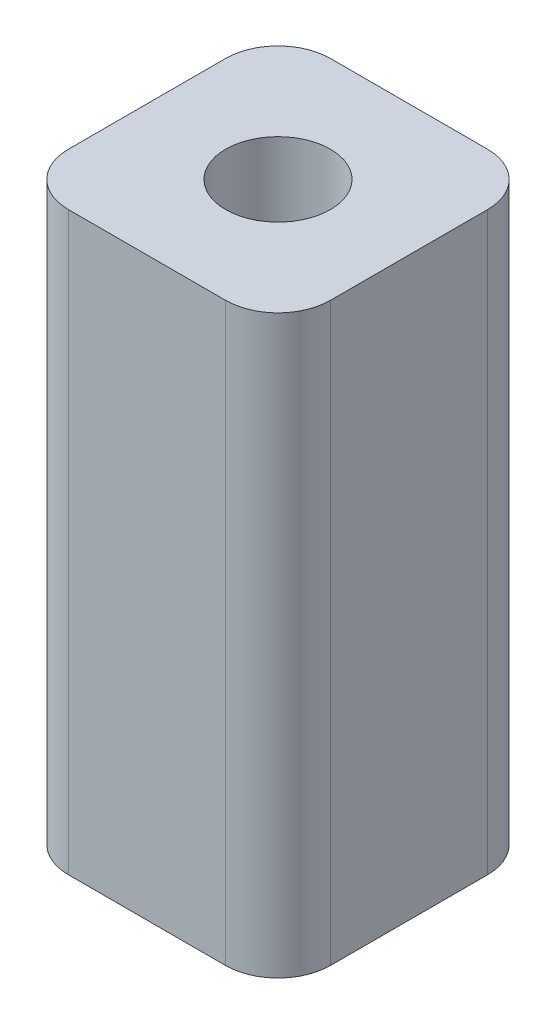
ISO-10303-21;
HEADER;
FILE_DESCRIPTION(('STEP AP214'),'2;1');
FILE_NAME('part.step','',(''),(''),'','','');
FILE_SCHEMA(('AUTOMOTIVE_DESIGN { 1 0 10303 214 1 1 1 1 }'));
ENDSEC;
DATA;
#1=APPLICATION_CONTEXT('core data for automotive mechanical design processes');
#2=APPLICATION_PROTOCOL_DEFINITION('international standard','automotive_design',2000,#1);
#3=PRODUCT_CONTEXT('',#1,'mechanical');
#4=PRODUCT('Part','Part','',(#3));
#5=PRODUCT_RELATED_PRODUCT_CATEGORY('part','',(#4));
#6=PRODUCT_DEFINITION_FORMATION('','',#4);
#7=PRODUCT_DEFINITION_CONTEXT('part definition',#1,'design');
#8=PRODUCT_DEFINITION('design','',#6,#7);
#9=PRODUCT_DEFINITION_SHAPE('','',#8);
#10=(LENGTH_UNIT() NAMED_UNIT(*) SI_UNIT(.MILLI.,.METRE.));
#11=(NAMED_UNIT(*) PLANE_ANGLE_UNIT() SI_UNIT($,.RADIAN.));
#12=(NAMED_UNIT(*) SI_UNIT($,.STERADIAN.) SOLID_ANGLE_UNIT());
#13=UNCERTAINTY_MEASURE_WITH_UNIT(LENGTH_MEASURE(1.E-05),#10,'distance_accuracy_value','');
#14=(GEOMETRIC_REPRESENTATION_CONTEXT(3) GLOBAL_UNCERTAINTY_ASSIGNED_CONTEXT((#13)) GLOBAL_UNIT_ASSIGNED_CONTEXT((#10,
#11,#12)) REPRESENTATION_CONTEXT('',''));
#15=CARTESIAN_POINT('',(0.,0.,0.));
#16=DIRECTION('',(0.,0.,1.));
#17=DIRECTION('',(1.,0.,0.));
#18=AXIS2_PLACEMENT_3D('',#15,#16,#17);
#19=CARTESIAN_POINT('',(-1.5,11.,1.5));
#20=DIRECTION('',(0.,1.,0.));
#21=DIRECTION('',(0.,0.,1.));
#22=AXIS2_PLACEMENT_3D('',#19,#20,#21);
#23=PLANE('',#22);
#24=CARTESIAN_POINT('',(-1.5,11.,1.5));
#25=DIRECTION('',(0.,1.,0.));
#26=DIRECTION('',(0.,0.,1.));
#27=AXIS2_PLACEMENT_3D('',#24,#25,#26);
#28=CIRCLE('',#27,1.);
#29=CARTESIAN_POINT('',(-2.5,11.,1.49999999999999));
#30=VERTEX_POINT('',#29);
#31=CARTESIAN_POINT('',(-1.49999999999999,11.,2.5));
#32=VERTEX_POINT('',#31);
#33=EDGE_CURVE('E164',#30,#32,#28,.T.);
#34=ORIENTED_EDGE('',*,*,#33,.T.);
#35=DIRECTION('',(1.,0.,0.));
#36=VECTOR('',#35,1.);
#37=CARTESIAN_POINT('',(-1.49999999999999,11.,2.5));
#38=LINE('',#37,#36);
#39=CARTESIAN_POINT('',(1.49999999999999,11.,2.5));
#40=VERTEX_POINT('',#39);
#41=EDGE_CURVE('E100',#32,#40,#38,.T.);
#42=ORIENTED_EDGE('',*,*,#41,.T.);
#43=CARTESIAN_POINT('',(1.5,11.,1.5));
#44=DIRECTION('',(0.,1.,0.));
#45=DIRECTION('',(0.,0.,1.));
#46=AXIS2_PLACEMENT_3D('',#43,#44,#45);
#47=CIRCLE('',#46,1.);
#48=CARTESIAN_POINT('',(2.5,11.,1.49999999999999));
#49=VERTEX_POINT('',#48);
#50=EDGE_CURVE('E185',#40,#49,#47,.T.);
#51=ORIENTED_EDGE('',*,*,#50,.T.);
#52=DIRECTION('',(0.,0.,-1.));
#53=VECTOR('',#52,1.);
#54=CARTESIAN_POINT('',(2.5,11.,-1.49999999999999));
#55=LINE('',#54,#53);
#56=CARTESIAN_POINT('',(2.5,11.,-1.49999999999999));
#57=VERTEX_POINT('',#56);
#58=EDGE_CURVE('E199',#49,#57,#55,.T.);
#59=ORIENTED_EDGE('',*,*,#58,.T.);
#60=CARTESIAN_POINT('',(1.5,11.,-1.5));
#61=DIRECTION('',(0.,1.,0.));
#62=DIRECTION('',(0.,0.,-1.));
#63=AXIS2_PLACEMENT_3D('',#60,#61,#62);
#64=CIRCLE('',#63,1.);
#65=CARTESIAN_POINT('',(1.49999999999999,11.,-2.5));
#66=VERTEX_POINT('',#65);
#67=EDGE_CURVE('E119',#57,#66,#64,.T.);
#68=ORIENTED_EDGE('',*,*,#67,.T.);
#69=DIRECTION('',(-1.,0.,0.));
#70=VECTOR('',#69,1.);
#71=CARTESIAN_POINT('',(-1.49999999999999,11.,-2.5));
#72=LINE('',#71,#70);
#73=CARTESIAN_POINT('',(-1.49999999999999,11.,-2.5));
#74=VERTEX_POINT('',#73);
#75=EDGE_CURVE('E113',#66,#74,#72,.T.);
#76=ORIENTED_EDGE('',*,*,#75,.T.);
#77=CARTESIAN_POINT('',(-1.5,11.,-1.5));
#78=DIRECTION('',(0.,1.,0.));
#79=DIRECTION('',(0.,0.,1.));
#80=AXIS2_PLACEMENT_3D('',#77,#78,#79);
#81=CIRCLE('',#80,1.);
#82=CARTESIAN_POINT('',(-2.5,11.,-1.49999999999999));
#83=VERTEX_POINT('',#82);
#84=EDGE_CURVE('E117',#74,#83,#81,.T.);
#85=ORIENTED_EDGE('',*,*,#84,.T.);
#86=DIRECTION('',(0.,0.,1.));
#87=VECTOR('',#86,1.);
#88=CARTESIAN_POINT('',(-2.5,11.,-1.49999999999999));
#89=LINE('',#88,#87);
#90=EDGE_CURVE('E57',#83,#30,#89,.T.);
#91=ORIENTED_EDGE('',*,*,#90,.T.);
#92=EDGE_LOOP('',(#34,#42,#51,#59,#68,#76,#85,#91));
#93=FACE_BOUND('',#92,.T.);
#94=CARTESIAN_POINT('',(0.,11.,0.));
#95=DIRECTION('',(0.,1.,0.));
#96=DIRECTION('',(0.,0.,1.));
#97=AXIS2_PLACEMENT_3D('',#94,#95,#96);
#98=CIRCLE('',#97,1.);
#99=CARTESIAN_POINT('',(0.,11.,1.));
#100=VERTEX_POINT('',#99);
#101=EDGE_CURVE('E146',#100,#100,#98,.T.);
#102=ORIENTED_EDGE('',*,*,#101,.F.);
#103=EDGE_LOOP('',(#102));
#104=FACE_BOUND('',#103,.T.);
#105=ADVANCED_FACE('F39',(#93,#104),#23,.T.);
#106=CARTESIAN_POINT('',(-1.5,0.,1.5));
#107=DIRECTION('',(0.,1.,0.));
#108=DIRECTION('',(0.,0.,1.));
#109=AXIS2_PLACEMENT_3D('',#106,#107,#108);
#110=PLANE('',#109);
#111=CARTESIAN_POINT('',(-1.5,0.,1.5));
#112=DIRECTION('',(0.,1.,0.));
#113=DIRECTION('',(0.,0.,1.));
#114=AXIS2_PLACEMENT_3D('',#111,#112,#113);
#115=CIRCLE('',#114,1.);
#116=CARTESIAN_POINT('',(-2.5,0.,1.49999999999999));
#117=VERTEX_POINT('',#116);
#118=CARTESIAN_POINT('',(-1.49999999999999,0.,2.5));
#119=VERTEX_POINT('',#118);
#120=EDGE_CURVE('E141',#117,#119,#115,.T.);
#121=ORIENTED_EDGE('',*,*,#120,.F.);
#122=DIRECTION('',(0.,0.,1.));
#123=VECTOR('',#122,1.);
#124=CARTESIAN_POINT('',(-2.5,0.,-1.49999999999999));
#125=LINE('',#124,#123);
#126=CARTESIAN_POINT('',(-2.5,0.,-1.49999999999999));
#127=VERTEX_POINT('',#126);
#128=EDGE_CURVE('E92',#127,#117,#125,.T.);
#129=ORIENTED_EDGE('',*,*,#128,.F.);
#130=CARTESIAN_POINT('',(-1.5,0.,-1.5));
#131=DIRECTION('',(0.,1.,0.));
#132=DIRECTION('',(0.,0.,1.));
#133=AXIS2_PLACEMENT_3D('',#130,#131,#132);
#134=CIRCLE('',#133,1.);
#135=CARTESIAN_POINT('',(-1.49999999999999,0.,-2.5));
#136=VERTEX_POINT('',#135);
#137=EDGE_CURVE('E86',#136,#127,#134,.T.);
#138=ORIENTED_EDGE('',*,*,#137,.F.);
#139=DIRECTION('',(-1.,0.,0.));
#140=VECTOR('',#139,1.);
#141=CARTESIAN_POINT('',(-1.49999999999999,0.,-2.5));
#142=LINE('',#141,#140);
#143=CARTESIAN_POINT('',(1.49999999999999,0.,-2.5));
#144=VERTEX_POINT('',#143);
#145=EDGE_CURVE('E128',#144,#136,#142,.T.);
#146=ORIENTED_EDGE('',*,*,#145,.F.);
#147=CARTESIAN_POINT('',(1.5,0.,-1.5));
#148=DIRECTION('',(0.,1.,0.));
#149=DIRECTION('',(0.,0.,-1.));
#150=AXIS2_PLACEMENT_3D('',#147,#148,#149);
#151=CIRCLE('',#150,1.);
#152=CARTESIAN_POINT('',(2.5,0.,-1.49999999999999));
#153=VERTEX_POINT('',#152);
#154=EDGE_CURVE('E155',#153,#144,#151,.T.);
#155=ORIENTED_EDGE('',*,*,#154,.F.);
#156=DIRECTION('',(0.,0.,-1.));
#157=VECTOR('',#156,1.);
#158=CARTESIAN_POINT('',(2.5,0.,-1.49999999999999));
#159=LINE('',#158,#157);
#160=CARTESIAN_POINT('',(2.5,0.,1.49999999999999));
#161=VERTEX_POINT('',#160);
#162=EDGE_CURVE('E152',#161,#153,#159,.T.);
#163=ORIENTED_EDGE('',*,*,#162,.F.);
#164=CARTESIAN_POINT('',(1.5,0.,1.5));
#165=DIRECTION('',(0.,1.,0.));
#166=DIRECTION('',(0.,0.,1.));
#167=AXIS2_PLACEMENT_3D('',#164,#165,#166);
#168=CIRCLE('',#167,1.);
#169=CARTESIAN_POINT('',(1.49999999999999,0.,2.5));
#170=VERTEX_POINT('',#169);
#171=EDGE_CURVE('E149',#170,#161,#168,.T.);
#172=ORIENTED_EDGE('',*,*,#171,.F.);
#173=DIRECTION('',(1.,0.,0.));
#174=VECTOR('',#173,1.);
#175=CARTESIAN_POINT('',(-1.49999999999999,0.,2.5));
#176=LINE('',#175,#174);
#177=EDGE_CURVE('E145',#119,#170,#176,.T.);
#178=ORIENTED_EDGE('',*,*,#177,.F.);
#179=EDGE_LOOP('',(#121,#129,#138,#146,#155,#163,#172,#178));
#180=FACE_BOUND('',#179,.T.);
#181=CARTESIAN_POINT('',(0.,0.,0.));
#182=DIRECTION('',(0.,1.,0.));
#183=DIRECTION('',(0.,0.,1.));
#184=AXIS2_PLACEMENT_3D('',#181,#182,#183);
#185=CIRCLE('',#184,1.);
#186=CARTESIAN_POINT('',(0.,0.,1.));
#187=VERTEX_POINT('',#186);
#188=EDGE_CURVE('E209',#187,#187,#185,.T.);
#189=ORIENTED_EDGE('',*,*,#188,.T.);
#190=EDGE_LOOP('',(#189));
#191=FACE_BOUND('',#190,.T.);
#192=ADVANCED_FACE('F189',(#180,#191),#110,.F.);
#193=CARTESIAN_POINT('',(-1.5,11.,1.5));
#194=DIRECTION('',(0.,-1.,0.));
#195=DIRECTION('',(0.,0.,-1.));
#196=AXIS2_PLACEMENT_3D('',#193,#194,#195);
#197=CYLINDRICAL_SURFACE('',#196,1.);
#198=ORIENTED_EDGE('',*,*,#120,.T.);
#199=DIRECTION('',(0.,-1.,0.));
#200=VECTOR('',#199,1.);
#201=CARTESIAN_POINT('',(-1.49999999999999,11.,2.5));
#202=LINE('',#201,#200);
#203=EDGE_CURVE('E11',#32,#119,#202,.T.);
#204=ORIENTED_EDGE('',*,*,#203,.F.);
#205=ORIENTED_EDGE('',*,*,#33,.F.);
#206=DIRECTION('',(0.,-1.,0.));
#207=VECTOR('',#206,1.);
#208=CARTESIAN_POINT('',(-2.5,11.,1.49999999999999));
#209=LINE('',#208,#207);
#210=EDGE_CURVE('E137',#30,#117,#209,.T.);
#211=ORIENTED_EDGE('',*,*,#210,.T.);
#212=EDGE_LOOP('',(#198,#204,#205,#211));
#213=FACE_BOUND('',#212,.T.);
#214=ADVANCED_FACE('F41',(#213),#197,.T.);
#215=CARTESIAN_POINT('',(-1.49999999999999,11.,2.5));
#216=DIRECTION('',(0.,0.,-1.));
#217=DIRECTION('',(-1.,0.,0.));
#218=AXIS2_PLACEMENT_3D('',#215,#216,#217);
#219=PLANE('',#218);
#220=ORIENTED_EDGE('',*,*,#177,.T.);
#221=DIRECTION('',(0.,-1.,0.));
#222=VECTOR('',#221,1.);
#223=CARTESIAN_POINT('',(1.49999999999999,11.,2.5));
#224=LINE('',#223,#222);
#225=EDGE_CURVE('E49',#40,#170,#224,.T.);
#226=ORIENTED_EDGE('',*,*,#225,.F.);
#227=ORIENTED_EDGE('',*,*,#41,.F.);
#228=ORIENTED_EDGE('',*,*,#203,.T.);
#229=EDGE_LOOP('',(#220,#226,#227,#228));
#230=FACE_BOUND('',#229,.T.);
#231=ADVANCED_FACE('F239',(#230),#219,.F.);
#232=CARTESIAN_POINT('',(1.5,11.,1.5));
#233=DIRECTION('',(0.,-1.,0.));
#234=DIRECTION('',(0.,0.,-1.));
#235=AXIS2_PLACEMENT_3D('',#232,#233,#234);
#236=CYLINDRICAL_SURFACE('',#235,1.);
#237=ORIENTED_EDGE('',*,*,#171,.T.);
#238=DIRECTION('',(0.,-1.,0.));
#239=VECTOR('',#238,1.);
#240=CARTESIAN_POINT('',(2.5,11.,1.49999999999999));
#241=LINE('',#240,#239);
#242=EDGE_CURVE('E175',#49,#161,#241,.T.);
#243=ORIENTED_EDGE('',*,*,#242,.F.);
#244=ORIENTED_EDGE('',*,*,#50,.F.);
#245=ORIENTED_EDGE('',*,*,#225,.T.);
#246=EDGE_LOOP('',(#237,#243,#244,#245));
#247=FACE_BOUND('',#246,.T.);
#248=ADVANCED_FACE('F183',(#247),#236,.T.);
#249=CARTESIAN_POINT('',(2.5,11.,-1.49999999999999));
#250=DIRECTION('',(-1.,0.,0.));
#251=DIRECTION('',(0.,0.,1.));
#252=AXIS2_PLACEMENT_3D('',#249,#250,#251);
#253=PLANE('',#252);
#254=ORIENTED_EDGE('',*,*,#162,.T.);
#255=DIRECTION('',(0.,-1.,0.));
#256=VECTOR('',#255,1.);
#257=CARTESIAN_POINT('',(2.5,11.,-1.49999999999999));
#258=LINE('',#257,#256);
#259=EDGE_CURVE('E171',#57,#153,#258,.T.);
#260=ORIENTED_EDGE('',*,*,#259,.F.);
#261=ORIENTED_EDGE('',*,*,#58,.F.);
#262=ORIENTED_EDGE('',*,*,#242,.T.);
#263=EDGE_LOOP('',(#254,#260,#261,#262));
#264=FACE_BOUND('',#263,.T.);
#265=ADVANCED_FACE('F194',(#264),#253,.F.);
#266=CARTESIAN_POINT('',(1.5,11.,-1.5));
#267=DIRECTION('',(0.,-1.,0.));
#268=DIRECTION('',(0.,0.,-1.));
#269=AXIS2_PLACEMENT_3D('',#266,#267,#268);
#270=CYLINDRICAL_SURFACE('',#269,1.);
#271=ORIENTED_EDGE('',*,*,#154,.T.);
#272=DIRECTION('',(0.,-1.,0.));
#273=VECTOR('',#272,1.);
#274=CARTESIAN_POINT('',(1.49999999999999,11.,-2.5));
#275=LINE('',#274,#273);
#276=EDGE_CURVE('E130',#66,#144,#275,.T.);
#277=ORIENTED_EDGE('',*,*,#276,.F.);
#278=ORIENTED_EDGE('',*,*,#67,.F.);
#279=ORIENTED_EDGE('',*,*,#259,.T.);
#280=EDGE_LOOP('',(#271,#277,#278,#279));
#281=FACE_BOUND('',#280,.T.);
#282=ADVANCED_FACE('F197',(#281),#270,.T.);
#283=CARTESIAN_POINT('',(-1.49999999999999,11.,-2.5));
#284=DIRECTION('',(0.,0.,1.));
#285=DIRECTION('',(1.,0.,0.));
#286=AXIS2_PLACEMENT_3D('',#283,#284,#285);
#287=PLANE('',#286);
#288=ORIENTED_EDGE('',*,*,#145,.T.);
#289=DIRECTION('',(0.,-1.,0.));
#290=VECTOR('',#289,1.);
#291=CARTESIAN_POINT('',(-1.49999999999999,11.,-2.5));
#292=LINE('',#291,#290);
#293=EDGE_CURVE('E125',#74,#136,#292,.T.);
#294=ORIENTED_EDGE('',*,*,#293,.F.);
#295=ORIENTED_EDGE('',*,*,#75,.F.);
#296=ORIENTED_EDGE('',*,*,#276,.T.);
#297=EDGE_LOOP('',(#288,#294,#295,#296));
#298=FACE_BOUND('',#297,.T.);
#299=ADVANCED_FACE('F126',(#298),#287,.F.);
#300=CARTESIAN_POINT('',(-1.5,11.,-1.5));
#301=DIRECTION('',(0.,-1.,0.));
#302=DIRECTION('',(0.,0.,-1.));
#303=AXIS2_PLACEMENT_3D('',#300,#301,#302);
#304=CYLINDRICAL_SURFACE('',#303,1.);
#305=ORIENTED_EDGE('',*,*,#137,.T.);
#306=DIRECTION('',(0.,-1.,0.));
#307=VECTOR('',#306,1.);
#308=CARTESIAN_POINT('',(-2.5,11.,-1.49999999999999));
#309=LINE('',#308,#307);
#310=EDGE_CURVE('E131',#83,#127,#309,.T.);
#311=ORIENTED_EDGE('',*,*,#310,.F.);
#312=ORIENTED_EDGE('',*,*,#84,.F.);
#313=ORIENTED_EDGE('',*,*,#293,.T.);
#314=EDGE_LOOP('',(#305,#311,#312,#313));
#315=FACE_BOUND('',#314,.T.);
#316=ADVANCED_FACE('F133',(#315),#304,.T.);
#317=CARTESIAN_POINT('',(-2.5,11.,-1.49999999999999));
#318=DIRECTION('',(1.,0.,0.));
#319=DIRECTION('',(0.,0.,-1.));
#320=AXIS2_PLACEMENT_3D('',#317,#318,#319);
#321=PLANE('',#320);
#322=ORIENTED_EDGE('',*,*,#128,.T.);
#323=ORIENTED_EDGE('',*,*,#210,.F.);
#324=ORIENTED_EDGE('',*,*,#90,.F.);
#325=ORIENTED_EDGE('',*,*,#310,.T.);
#326=EDGE_LOOP('',(#322,#323,#324,#325));
#327=FACE_BOUND('',#326,.T.);
#328=ADVANCED_FACE('F227',(#327),#321,.F.);
#329=CARTESIAN_POINT('',(0.,11.,0.));
#330=DIRECTION('',(0.,-1.,0.));
#331=DIRECTION('',(0.,0.,-1.));
#332=AXIS2_PLACEMENT_3D('',#329,#330,#331);
#333=CYLINDRICAL_SURFACE('',#332,1.);
#334=ORIENTED_EDGE('',*,*,#101,.T.);
#335=EDGE_LOOP('',(#334));
#336=FACE_BOUND('',#335,.T.);
#337=ORIENTED_EDGE('',*,*,#188,.F.);
#338=EDGE_LOOP('',(#337));
#339=FACE_BOUND('',#338,.T.);
#340=ADVANCED_FACE('F217',(#336,#339),#333,.F.);
#341=CLOSED_SHELL('',(#105,#192,#214,#231,#248,#265,#282,#299,#316,#328,#340));
#342=MANIFOLD_SOLID_BREP('B2',#341);
#343=ADVANCED_BREP_SHAPE_REPRESENTATION('',(#18,#342),#14);
#344=SHAPE_DEFINITION_REPRESENTATION(#9,#343);
ENDSEC;
END-ISO-10303-21;
